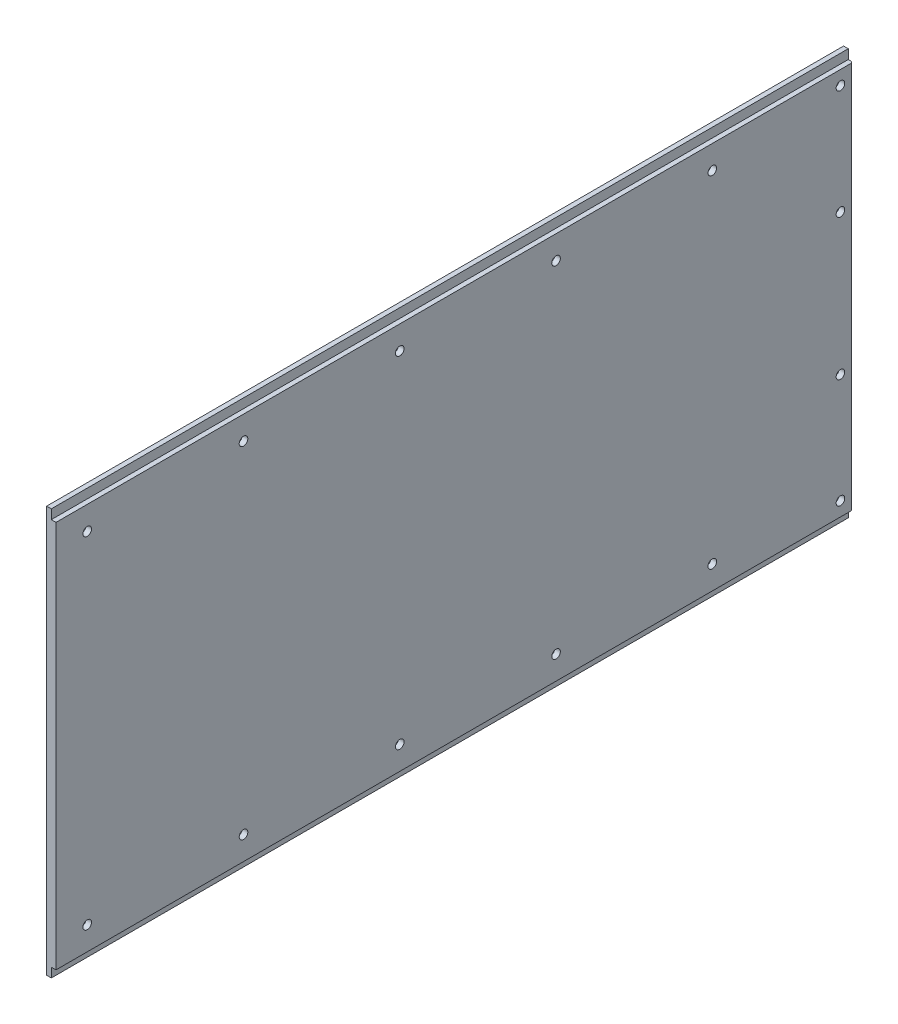
ISO-10303-21;
HEADER;
FILE_DESCRIPTION(('STEP AP214'),'2;1');
FILE_NAME('part.step','',(''),(''),'','','');
FILE_SCHEMA(('AUTOMOTIVE_DESIGN { 1 0 10303 214 1 1 1 1 }'));
ENDSEC;
DATA;
#1=APPLICATION_CONTEXT('core data for automotive mechanical design processes');
#2=APPLICATION_PROTOCOL_DEFINITION('international standard','automotive_design',2000,#1);
#3=PRODUCT_CONTEXT('',#1,'mechanical');
#4=PRODUCT('Part','Part','',(#3));
#5=PRODUCT_RELATED_PRODUCT_CATEGORY('part','',(#4));
#6=PRODUCT_DEFINITION_FORMATION('','',#4);
#7=PRODUCT_DEFINITION_CONTEXT('part definition',#1,'design');
#8=PRODUCT_DEFINITION('design','',#6,#7);
#9=PRODUCT_DEFINITION_SHAPE('','',#8);
#10=(LENGTH_UNIT() NAMED_UNIT(*) SI_UNIT(.MILLI.,.METRE.));
#11=(NAMED_UNIT(*) PLANE_ANGLE_UNIT() SI_UNIT($,.RADIAN.));
#12=(NAMED_UNIT(*) SI_UNIT($,.STERADIAN.) SOLID_ANGLE_UNIT());
#13=UNCERTAINTY_MEASURE_WITH_UNIT(LENGTH_MEASURE(1.E-05),#10,'distance_accuracy_value','');
#14=(GEOMETRIC_REPRESENTATION_CONTEXT(3) GLOBAL_UNCERTAINTY_ASSIGNED_CONTEXT((#13)) GLOBAL_UNIT_ASSIGNED_CONTEXT((#10,
#11,#12)) REPRESENTATION_CONTEXT('',''));
#15=CARTESIAN_POINT('',(0.,0.,0.));
#16=DIRECTION('',(0.,0.,1.));
#17=DIRECTION('',(1.,0.,0.));
#18=AXIS2_PLACEMENT_3D('',#15,#16,#17);
#19=CARTESIAN_POINT('',(6.,-130.,255.));
#20=DIRECTION('',(0.,0.,-1.));
#21=DIRECTION('',(-1.,0.,0.));
#22=AXIS2_PLACEMENT_3D('',#19,#20,#21);
#23=PLANE('',#22);
#24=DIRECTION('',(0.,-1.,0.));
#25=VECTOR('',#24,1.);
#26=CARTESIAN_POINT('',(6.,-130.,255.));
#27=LINE('',#26,#25);
#28=CARTESIAN_POINT('',(6.,124.,255.));
#29=VERTEX_POINT('',#28);
#30=CARTESIAN_POINT('',(6.,-124.,255.));
#31=VERTEX_POINT('',#30);
#32=EDGE_CURVE('E132',#29,#31,#27,.T.);
#33=ORIENTED_EDGE('',*,*,#32,.F.);
#34=DIRECTION('',(1.,0.,0.));
#35=VECTOR('',#34,1.);
#36=CARTESIAN_POINT('',(6.,124.,255.));
#37=LINE('',#36,#35);
#38=CARTESIAN_POINT('',(3.,124.,255.));
#39=VERTEX_POINT('',#38);
#40=EDGE_CURVE('E114',#39,#29,#37,.T.);
#41=ORIENTED_EDGE('',*,*,#40,.F.);
#42=DIRECTION('',(0.,-1.,0.));
#43=VECTOR('',#42,1.);
#44=CARTESIAN_POINT('',(3.,130.,255.));
#45=LINE('',#44,#43);
#46=CARTESIAN_POINT('',(3.,130.,255.));
#47=VERTEX_POINT('',#46);
#48=EDGE_CURVE('E606',#47,#39,#45,.T.);
#49=ORIENTED_EDGE('',*,*,#48,.F.);
#50=DIRECTION('',(-1.,0.,0.));
#51=VECTOR('',#50,1.);
#52=CARTESIAN_POINT('',(6.,130.,255.));
#53=LINE('',#52,#51);
#54=CARTESIAN_POINT('',(0.,130.,255.));
#55=VERTEX_POINT('',#54);
#56=EDGE_CURVE('E122',#47,#55,#53,.T.);
#57=ORIENTED_EDGE('',*,*,#56,.T.);
#58=DIRECTION('',(0.,-1.,0.));
#59=VECTOR('',#58,1.);
#60=CARTESIAN_POINT('',(0.,-130.,255.));
#61=LINE('',#60,#59);
#62=CARTESIAN_POINT('',(0.,-130.,255.));
#63=VERTEX_POINT('',#62);
#64=EDGE_CURVE('E590',#55,#63,#61,.T.);
#65=ORIENTED_EDGE('',*,*,#64,.T.);
#66=DIRECTION('',(-1.,0.,0.));
#67=VECTOR('',#66,1.);
#68=CARTESIAN_POINT('',(6.,-130.,255.));
#69=LINE('',#68,#67);
#70=CARTESIAN_POINT('',(3.,-130.,255.));
#71=VERTEX_POINT('',#70);
#72=EDGE_CURVE('E130',#71,#63,#69,.T.);
#73=ORIENTED_EDGE('',*,*,#72,.F.);
#74=DIRECTION('',(0.,-1.,0.));
#75=VECTOR('',#74,1.);
#76=CARTESIAN_POINT('',(3.,-130.,255.));
#77=LINE('',#76,#75);
#78=CARTESIAN_POINT('',(3.,-124.,255.));
#79=VERTEX_POINT('',#78);
#80=EDGE_CURVE('E568',#79,#71,#77,.T.);
#81=ORIENTED_EDGE('',*,*,#80,.F.);
#82=DIRECTION('',(-1.,0.,0.));
#83=VECTOR('',#82,1.);
#84=CARTESIAN_POINT('',(6.,-124.,255.));
#85=LINE('',#84,#83);
#86=EDGE_CURVE('E578',#31,#79,#85,.T.);
#87=ORIENTED_EDGE('',*,*,#86,.F.);
#88=EDGE_LOOP('',(#33,#41,#49,#57,#65,#73,#81,#87));
#89=FACE_BOUND('',#88,.T.);
#90=ADVANCED_FACE('F34',(#89),#23,.F.);
#91=CARTESIAN_POINT('',(6.,-130.,-255.));
#92=DIRECTION('',(0.,1.,0.));
#93=DIRECTION('',(0.,0.,1.));
#94=AXIS2_PLACEMENT_3D('',#91,#92,#93);
#95=PLANE('',#94);
#96=DIRECTION('',(-1.,0.,0.));
#97=VECTOR('',#96,1.);
#98=CARTESIAN_POINT('',(6.,-130.,-255.));
#99=LINE('',#98,#97);
#100=CARTESIAN_POINT('',(3.,-130.,-255.));
#101=VERTEX_POINT('',#100);
#102=CARTESIAN_POINT('',(0.,-130.,-255.));
#103=VERTEX_POINT('',#102);
#104=EDGE_CURVE('E128',#101,#103,#99,.T.);
#105=ORIENTED_EDGE('',*,*,#104,.F.);
#106=DIRECTION('',(0.,0.,1.));
#107=VECTOR('',#106,1.);
#108=CARTESIAN_POINT('',(3.,-130.,-255.));
#109=LINE('',#108,#107);
#110=EDGE_CURVE('E587',#101,#71,#109,.T.);
#111=ORIENTED_EDGE('',*,*,#110,.T.);
#112=ORIENTED_EDGE('',*,*,#72,.T.);
#113=DIRECTION('',(0.,0.,-1.));
#114=VECTOR('',#113,1.);
#115=CARTESIAN_POINT('',(0.,-130.,-255.));
#116=LINE('',#115,#114);
#117=EDGE_CURVE('E597',#63,#103,#116,.T.);
#118=ORIENTED_EDGE('',*,*,#117,.T.);
#119=EDGE_LOOP('',(#105,#111,#112,#118));
#120=FACE_BOUND('',#119,.T.);
#121=ADVANCED_FACE('F198',(#120),#95,.F.);
#122=CARTESIAN_POINT('',(6.,130.,-255.));
#123=DIRECTION('',(0.,0.,1.));
#124=DIRECTION('',(1.,0.,0.));
#125=AXIS2_PLACEMENT_3D('',#122,#123,#124);
#126=PLANE('',#125);
#127=DIRECTION('',(1.,0.,0.));
#128=VECTOR('',#127,1.);
#129=CARTESIAN_POINT('',(6.,124.,-255.));
#130=LINE('',#129,#128);
#131=CARTESIAN_POINT('',(3.,124.,-255.));
#132=VERTEX_POINT('',#131);
#133=CARTESIAN_POINT('',(5.00000000000006,124.,-255.));
#134=VERTEX_POINT('',#133);
#135=EDGE_CURVE('E113',#132,#134,#130,.T.);
#136=ORIENTED_EDGE('',*,*,#135,.T.);
#137=DIRECTION('',(0.,-1.,0.));
#138=VECTOR('',#137,1.);
#139=CARTESIAN_POINT('',(5.00000000000006,130.,-255.));
#140=LINE('',#139,#138);
#141=CARTESIAN_POINT('',(5.00000000000006,-124.,-255.));
#142=VERTEX_POINT('',#141);
#143=EDGE_CURVE('E49',#134,#142,#140,.T.);
#144=ORIENTED_EDGE('',*,*,#143,.T.);
#145=DIRECTION('',(-1.,0.,0.));
#146=VECTOR('',#145,1.);
#147=CARTESIAN_POINT('',(6.,-124.,-255.));
#148=LINE('',#147,#146);
#149=CARTESIAN_POINT('',(3.,-124.,-255.));
#150=VERTEX_POINT('',#149);
#151=EDGE_CURVE('E560',#142,#150,#148,.T.);
#152=ORIENTED_EDGE('',*,*,#151,.T.);
#153=DIRECTION('',(0.,-1.,0.));
#154=VECTOR('',#153,1.);
#155=CARTESIAN_POINT('',(3.,-130.,-255.));
#156=LINE('',#155,#154);
#157=EDGE_CURVE('E567',#150,#101,#156,.T.);
#158=ORIENTED_EDGE('',*,*,#157,.T.);
#159=ORIENTED_EDGE('',*,*,#104,.T.);
#160=DIRECTION('',(0.,1.,0.));
#161=VECTOR('',#160,1.);
#162=CARTESIAN_POINT('',(0.,130.,-255.));
#163=LINE('',#162,#161);
#164=CARTESIAN_POINT('',(0.,130.,-255.));
#165=VERTEX_POINT('',#164);
#166=EDGE_CURVE('E126',#103,#165,#163,.T.);
#167=ORIENTED_EDGE('',*,*,#166,.T.);
#168=DIRECTION('',(-1.,0.,0.));
#169=VECTOR('',#168,1.);
#170=CARTESIAN_POINT('',(6.,130.,-255.));
#171=LINE('',#170,#169);
#172=CARTESIAN_POINT('',(3.,130.,-255.));
#173=VERTEX_POINT('',#172);
#174=EDGE_CURVE('E120',#173,#165,#171,.T.);
#175=ORIENTED_EDGE('',*,*,#174,.F.);
#176=DIRECTION('',(0.,-1.,0.));
#177=VECTOR('',#176,1.);
#178=CARTESIAN_POINT('',(3.,130.,-255.));
#179=LINE('',#178,#177);
#180=EDGE_CURVE('E105',#173,#132,#179,.T.);
#181=ORIENTED_EDGE('',*,*,#180,.T.);
#182=EDGE_LOOP('',(#136,#144,#152,#158,#159,#167,#175,#181));
#183=FACE_BOUND('',#182,.T.);
#184=ADVANCED_FACE('F124',(#183),#126,.F.);
#185=CARTESIAN_POINT('',(6.,130.,255.));
#186=DIRECTION('',(0.,-1.,0.));
#187=DIRECTION('',(0.,0.,-1.));
#188=AXIS2_PLACEMENT_3D('',#185,#186,#187);
#189=PLANE('',#188);
#190=ORIENTED_EDGE('',*,*,#56,.F.);
#191=DIRECTION('',(0.,0.,1.));
#192=VECTOR('',#191,1.);
#193=CARTESIAN_POINT('',(3.,130.,-255.));
#194=LINE('',#193,#192);
#195=EDGE_CURVE('E109',#173,#47,#194,.T.);
#196=ORIENTED_EDGE('',*,*,#195,.F.);
#197=ORIENTED_EDGE('',*,*,#174,.T.);
#198=DIRECTION('',(0.,0.,1.));
#199=VECTOR('',#198,1.);
#200=CARTESIAN_POINT('',(0.,130.,255.));
#201=LINE('',#200,#199);
#202=EDGE_CURVE('E594',#165,#55,#201,.T.);
#203=ORIENTED_EDGE('',*,*,#202,.T.);
#204=EDGE_LOOP('',(#190,#196,#197,#203));
#205=FACE_BOUND('',#204,.T.);
#206=ADVANCED_FACE('F118',(#205),#189,.F.);
#207=CARTESIAN_POINT('',(6.,0.,0.));
#208=DIRECTION('',(-1.,0.,0.));
#209=DIRECTION('',(0.,0.,1.));
#210=AXIS2_PLACEMENT_3D('',#207,#208,#209);
#211=PLANE('',#210);
#212=CARTESIAN_POINT('',(6.00000000000001,109.,-165.));
#213=DIRECTION('',(-1.,0.,0.));
#214=DIRECTION('',(0.,0.,1.));
#215=AXIS2_PLACEMENT_3D('',#212,#213,#214);
#216=CIRCLE('',#215,2.74999999999999);
#217=CARTESIAN_POINT('',(6.00000000000001,109.,-162.25));
#218=VERTEX_POINT('',#217);
#219=EDGE_CURVE('E699',#218,#218,#216,.T.);
#220=ORIENTED_EDGE('',*,*,#219,.T.);
#221=EDGE_LOOP('',(#220));
#222=FACE_BOUND('',#221,.T.);
#223=CARTESIAN_POINT('',(6.00000000000001,109.,-65.));
#224=DIRECTION('',(-1.,0.,0.));
#225=DIRECTION('',(0.,0.,1.));
#226=AXIS2_PLACEMENT_3D('',#223,#224,#225);
#227=CIRCLE('',#226,2.74999999999999);
#228=CARTESIAN_POINT('',(6.00000000000001,109.,-62.25));
#229=VERTEX_POINT('',#228);
#230=EDGE_CURVE('E690',#229,#229,#227,.T.);
#231=ORIENTED_EDGE('',*,*,#230,.T.);
#232=EDGE_LOOP('',(#231));
#233=FACE_BOUND('',#232,.T.);
#234=CARTESIAN_POINT('',(6.00000000000001,109.,35.));
#235=DIRECTION('',(-1.,0.,0.));
#236=DIRECTION('',(0.,0.,1.));
#237=AXIS2_PLACEMENT_3D('',#234,#235,#236);
#238=CIRCLE('',#237,2.74999999999999);
#239=CARTESIAN_POINT('',(6.00000000000001,109.,37.75));
#240=VERTEX_POINT('',#239);
#241=EDGE_CURVE('E681',#240,#240,#238,.T.);
#242=ORIENTED_EDGE('',*,*,#241,.T.);
#243=EDGE_LOOP('',(#242));
#244=FACE_BOUND('',#243,.T.);
#245=CARTESIAN_POINT('',(6.00000000000001,109.,135.));
#246=DIRECTION('',(-1.,0.,0.));
#247=DIRECTION('',(0.,0.,1.));
#248=AXIS2_PLACEMENT_3D('',#245,#246,#247);
#249=CIRCLE('',#248,2.74999999999999);
#250=CARTESIAN_POINT('',(6.00000000000001,109.,137.75));
#251=VERTEX_POINT('',#250);
#252=EDGE_CURVE('E672',#251,#251,#249,.T.);
#253=ORIENTED_EDGE('',*,*,#252,.T.);
#254=EDGE_LOOP('',(#253));
#255=FACE_BOUND('',#254,.T.);
#256=CARTESIAN_POINT('',(6.00000000000001,109.,235.));
#257=DIRECTION('',(-1.,0.,0.));
#258=DIRECTION('',(0.,0.,1.));
#259=AXIS2_PLACEMENT_3D('',#256,#257,#258);
#260=CIRCLE('',#259,2.74999999999999);
#261=CARTESIAN_POINT('',(6.00000000000001,109.,237.75));
#262=VERTEX_POINT('',#261);
#263=EDGE_CURVE('E663',#262,#262,#260,.T.);
#264=ORIENTED_EDGE('',*,*,#263,.T.);
#265=EDGE_LOOP('',(#264));
#266=FACE_BOUND('',#265,.T.);
#267=CARTESIAN_POINT('',(6.00000000000001,-109.,135.));
#268=DIRECTION('',(-1.,0.,0.));
#269=DIRECTION('',(0.,0.,1.));
#270=AXIS2_PLACEMENT_3D('',#267,#268,#269);
#271=CIRCLE('',#270,2.74999999999999);
#272=CARTESIAN_POINT('',(6.00000000000001,-109.,137.75));
#273=VERTEX_POINT('',#272);
#274=EDGE_CURVE('E657',#273,#273,#271,.T.);
#275=ORIENTED_EDGE('',*,*,#274,.T.);
#276=EDGE_LOOP('',(#275));
#277=FACE_BOUND('',#276,.T.);
#278=CARTESIAN_POINT('',(6.00000000000001,-109.,235.));
#279=DIRECTION('',(-1.,0.,0.));
#280=DIRECTION('',(0.,0.,1.));
#281=AXIS2_PLACEMENT_3D('',#278,#279,#280);
#282=CIRCLE('',#281,2.74999999999999);
#283=CARTESIAN_POINT('',(6.00000000000001,-109.,237.75));
#284=VERTEX_POINT('',#283);
#285=EDGE_CURVE('E645',#284,#284,#282,.T.);
#286=ORIENTED_EDGE('',*,*,#285,.T.);
#287=EDGE_LOOP('',(#286));
#288=FACE_BOUND('',#287,.T.);
#289=CARTESIAN_POINT('',(6.,-115.,-247.));
#290=DIRECTION('',(-1.,0.,0.));
#291=DIRECTION('',(0.,0.,1.));
#292=AXIS2_PLACEMENT_3D('',#289,#290,#291);
#293=CIRCLE('',#292,2.75);
#294=CARTESIAN_POINT('',(6.,-115.,-244.25));
#295=VERTEX_POINT('',#294);
#296=EDGE_CURVE('E636',#295,#295,#293,.T.);
#297=ORIENTED_EDGE('',*,*,#296,.T.);
#298=EDGE_LOOP('',(#297));
#299=FACE_BOUND('',#298,.T.);
#300=CARTESIAN_POINT('',(6.,-45.,-247.));
#301=DIRECTION('',(-1.,0.,0.));
#302=DIRECTION('',(0.,0.,1.));
#303=AXIS2_PLACEMENT_3D('',#300,#301,#302);
#304=CIRCLE('',#303,2.75);
#305=CARTESIAN_POINT('',(6.,-45.,-244.25));
#306=VERTEX_POINT('',#305);
#307=EDGE_CURVE('E627',#306,#306,#304,.T.);
#308=ORIENTED_EDGE('',*,*,#307,.T.);
#309=EDGE_LOOP('',(#308));
#310=FACE_BOUND('',#309,.T.);
#311=CARTESIAN_POINT('',(6.,115.,-247.));
#312=DIRECTION('',(-1.,0.,0.));
#313=DIRECTION('',(0.,0.,1.));
#314=AXIS2_PLACEMENT_3D('',#311,#312,#313);
#315=CIRCLE('',#314,2.75);
#316=CARTESIAN_POINT('',(6.,115.,-244.25));
#317=VERTEX_POINT('',#316);
#318=EDGE_CURVE('E618',#317,#317,#315,.T.);
#319=ORIENTED_EDGE('',*,*,#318,.T.);
#320=EDGE_LOOP('',(#319));
#321=FACE_BOUND('',#320,.T.);
#322=CARTESIAN_POINT('',(6.,45.,-247.));
#323=DIRECTION('',(-1.,0.,0.));
#324=DIRECTION('',(0.,0.,1.));
#325=AXIS2_PLACEMENT_3D('',#322,#323,#324);
#326=CIRCLE('',#325,2.75);
#327=CARTESIAN_POINT('',(6.,45.,-244.25));
#328=VERTEX_POINT('',#327);
#329=EDGE_CURVE('E607',#328,#328,#326,.T.);
#330=ORIENTED_EDGE('',*,*,#329,.T.);
#331=EDGE_LOOP('',(#330));
#332=FACE_BOUND('',#331,.T.);
#333=DIRECTION('',(0.,0.,1.));
#334=VECTOR('',#333,1.);
#335=CARTESIAN_POINT('',(6.,-124.,-255.));
#336=LINE('',#335,#334);
#337=CARTESIAN_POINT('',(6.,-124.,-254.));
#338=VERTEX_POINT('',#337);
#339=EDGE_CURVE('E576',#338,#31,#336,.T.);
#340=ORIENTED_EDGE('',*,*,#339,.F.);
#341=DIRECTION('',(0.,1.,0.));
#342=VECTOR('',#341,1.);
#343=CARTESIAN_POINT('',(6.,0.,-254.));
#344=LINE('',#343,#342);
#345=CARTESIAN_POINT('',(6.,124.,-254.));
#346=VERTEX_POINT('',#345);
#347=EDGE_CURVE('E137',#338,#346,#344,.T.);
#348=ORIENTED_EDGE('',*,*,#347,.T.);
#349=DIRECTION('',(0.,0.,1.));
#350=VECTOR('',#349,1.);
#351=CARTESIAN_POINT('',(6.,124.,-255.));
#352=LINE('',#351,#350);
#353=EDGE_CURVE('E574',#346,#29,#352,.T.);
#354=ORIENTED_EDGE('',*,*,#353,.T.);
#355=ORIENTED_EDGE('',*,*,#32,.T.);
#356=EDGE_LOOP('',(#340,#348,#354,#355));
#357=FACE_BOUND('',#356,.T.);
#358=CARTESIAN_POINT('',(6.00000000000001,-109.,35.));
#359=DIRECTION('',(-1.,0.,0.));
#360=DIRECTION('',(0.,0.,1.));
#361=AXIS2_PLACEMENT_3D('',#358,#359,#360);
#362=CIRCLE('',#361,2.74999999999999);
#363=CARTESIAN_POINT('',(6.00000000000001,-109.,37.75));
#364=VERTEX_POINT('',#363);
#365=EDGE_CURVE('E147',#364,#364,#362,.T.);
#366=ORIENTED_EDGE('',*,*,#365,.T.);
#367=EDGE_LOOP('',(#366));
#368=FACE_BOUND('',#367,.T.);
#369=CARTESIAN_POINT('',(6.00000000000001,-109.,-65.));
#370=DIRECTION('',(-1.,0.,0.));
#371=DIRECTION('',(0.,0.,1.));
#372=AXIS2_PLACEMENT_3D('',#369,#370,#371);
#373=CIRCLE('',#372,2.74999999999999);
#374=CARTESIAN_POINT('',(6.00000000000001,-109.,-62.25));
#375=VERTEX_POINT('',#374);
#376=EDGE_CURVE('E156',#375,#375,#373,.T.);
#377=ORIENTED_EDGE('',*,*,#376,.T.);
#378=EDGE_LOOP('',(#377));
#379=FACE_BOUND('',#378,.T.);
#380=CARTESIAN_POINT('',(6.00000000000001,-109.,-165.));
#381=DIRECTION('',(-1.,0.,0.));
#382=DIRECTION('',(0.,0.,1.));
#383=AXIS2_PLACEMENT_3D('',#380,#381,#382);
#384=CIRCLE('',#383,2.74999999999999);
#385=CARTESIAN_POINT('',(6.00000000000001,-109.,-162.25));
#386=VERTEX_POINT('',#385);
#387=EDGE_CURVE('E42',#386,#386,#384,.T.);
#388=ORIENTED_EDGE('',*,*,#387,.T.);
#389=EDGE_LOOP('',(#388));
#390=FACE_BOUND('',#389,.T.);
#391=ADVANCED_FACE('F167',(#222,#233,#244,#255,#266,#277,#288,#299,#310,#321,#332,#357,#368,
#379,#390),#211,.F.);
#392=CARTESIAN_POINT('',(0.,0.,0.));
#393=DIRECTION('',(-1.,0.,0.));
#394=DIRECTION('',(0.,0.,1.));
#395=AXIS2_PLACEMENT_3D('',#392,#393,#394);
#396=PLANE('',#395);
#397=CARTESIAN_POINT('',(0.,109.,-165.));
#398=DIRECTION('',(-1.,0.,0.));
#399=DIRECTION('',(0.,0.,1.));
#400=AXIS2_PLACEMENT_3D('',#397,#398,#399);
#401=CIRCLE('',#400,5.2);
#402=CARTESIAN_POINT('',(0.,109.,-159.8));
#403=VERTEX_POINT('',#402);
#404=EDGE_CURVE('E705',#403,#403,#401,.T.);
#405=ORIENTED_EDGE('',*,*,#404,.F.);
#406=EDGE_LOOP('',(#405));
#407=FACE_BOUND('',#406,.T.);
#408=CARTESIAN_POINT('',(0.,109.,-65.));
#409=DIRECTION('',(-1.,0.,0.));
#410=DIRECTION('',(0.,0.,1.));
#411=AXIS2_PLACEMENT_3D('',#408,#409,#410);
#412=CIRCLE('',#411,5.2);
#413=CARTESIAN_POINT('',(0.,109.,-59.8));
#414=VERTEX_POINT('',#413);
#415=EDGE_CURVE('E696',#414,#414,#412,.T.);
#416=ORIENTED_EDGE('',*,*,#415,.F.);
#417=EDGE_LOOP('',(#416));
#418=FACE_BOUND('',#417,.T.);
#419=CARTESIAN_POINT('',(0.,109.,35.));
#420=DIRECTION('',(-1.,0.,0.));
#421=DIRECTION('',(0.,0.,1.));
#422=AXIS2_PLACEMENT_3D('',#419,#420,#421);
#423=CIRCLE('',#422,5.2);
#424=CARTESIAN_POINT('',(0.,109.,40.2));
#425=VERTEX_POINT('',#424);
#426=EDGE_CURVE('E687',#425,#425,#423,.T.);
#427=ORIENTED_EDGE('',*,*,#426,.F.);
#428=EDGE_LOOP('',(#427));
#429=FACE_BOUND('',#428,.T.);
#430=CARTESIAN_POINT('',(0.,109.,135.));
#431=DIRECTION('',(-1.,0.,0.));
#432=DIRECTION('',(0.,0.,1.));
#433=AXIS2_PLACEMENT_3D('',#430,#431,#432);
#434=CIRCLE('',#433,5.2);
#435=CARTESIAN_POINT('',(0.,109.,140.2));
#436=VERTEX_POINT('',#435);
#437=EDGE_CURVE('E678',#436,#436,#434,.T.);
#438=ORIENTED_EDGE('',*,*,#437,.F.);
#439=EDGE_LOOP('',(#438));
#440=FACE_BOUND('',#439,.T.);
#441=CARTESIAN_POINT('',(0.,109.,235.));
#442=DIRECTION('',(-1.,0.,0.));
#443=DIRECTION('',(0.,0.,1.));
#444=AXIS2_PLACEMENT_3D('',#441,#442,#443);
#445=CIRCLE('',#444,5.2);
#446=CARTESIAN_POINT('',(0.,109.,240.2));
#447=VERTEX_POINT('',#446);
#448=EDGE_CURVE('E669',#447,#447,#445,.T.);
#449=ORIENTED_EDGE('',*,*,#448,.F.);
#450=EDGE_LOOP('',(#449));
#451=FACE_BOUND('',#450,.T.);
#452=CARTESIAN_POINT('',(0.,-109.,135.));
#453=DIRECTION('',(-1.,0.,0.));
#454=DIRECTION('',(0.,0.,1.));
#455=AXIS2_PLACEMENT_3D('',#452,#453,#454);
#456=CIRCLE('',#455,5.2);
#457=CARTESIAN_POINT('',(0.,-109.,140.2));
#458=VERTEX_POINT('',#457);
#459=EDGE_CURVE('E660',#458,#458,#456,.T.);
#460=ORIENTED_EDGE('',*,*,#459,.F.);
#461=EDGE_LOOP('',(#460));
#462=FACE_BOUND('',#461,.T.);
#463=CARTESIAN_POINT('',(0.,-109.,235.));
#464=DIRECTION('',(-1.,0.,0.));
#465=DIRECTION('',(0.,0.,1.));
#466=AXIS2_PLACEMENT_3D('',#463,#464,#465);
#467=CIRCLE('',#466,5.2);
#468=CARTESIAN_POINT('',(0.,-109.,240.2));
#469=VERTEX_POINT('',#468);
#470=EDGE_CURVE('E651',#469,#469,#467,.T.);
#471=ORIENTED_EDGE('',*,*,#470,.F.);
#472=EDGE_LOOP('',(#471));
#473=FACE_BOUND('',#472,.T.);
#474=CARTESIAN_POINT('',(0.,-115.,-247.));
#475=DIRECTION('',(-1.,0.,0.));
#476=DIRECTION('',(0.,0.,1.));
#477=AXIS2_PLACEMENT_3D('',#474,#475,#476);
#478=CIRCLE('',#477,5.2);
#479=CARTESIAN_POINT('',(0.,-115.,-241.8));
#480=VERTEX_POINT('',#479);
#481=EDGE_CURVE('E642',#480,#480,#478,.T.);
#482=ORIENTED_EDGE('',*,*,#481,.F.);
#483=EDGE_LOOP('',(#482));
#484=FACE_BOUND('',#483,.T.);
#485=CARTESIAN_POINT('',(0.,-45.,-247.));
#486=DIRECTION('',(-1.,0.,0.));
#487=DIRECTION('',(0.,0.,1.));
#488=AXIS2_PLACEMENT_3D('',#485,#486,#487);
#489=CIRCLE('',#488,5.2);
#490=CARTESIAN_POINT('',(0.,-45.,-241.8));
#491=VERTEX_POINT('',#490);
#492=EDGE_CURVE('E633',#491,#491,#489,.T.);
#493=ORIENTED_EDGE('',*,*,#492,.F.);
#494=EDGE_LOOP('',(#493));
#495=FACE_BOUND('',#494,.T.);
#496=CARTESIAN_POINT('',(0.,115.,-247.));
#497=DIRECTION('',(-1.,0.,0.));
#498=DIRECTION('',(0.,0.,1.));
#499=AXIS2_PLACEMENT_3D('',#496,#497,#498);
#500=CIRCLE('',#499,5.2);
#501=CARTESIAN_POINT('',(0.,115.,-241.8));
#502=VERTEX_POINT('',#501);
#503=EDGE_CURVE('E624',#502,#502,#500,.T.);
#504=ORIENTED_EDGE('',*,*,#503,.F.);
#505=EDGE_LOOP('',(#504));
#506=FACE_BOUND('',#505,.T.);
#507=CARTESIAN_POINT('',(0.,45.,-247.));
#508=DIRECTION('',(-1.,0.,0.));
#509=DIRECTION('',(0.,0.,1.));
#510=AXIS2_PLACEMENT_3D('',#507,#508,#509);
#511=CIRCLE('',#510,5.2);
#512=CARTESIAN_POINT('',(0.,45.,-241.8));
#513=VERTEX_POINT('',#512);
#514=EDGE_CURVE('E615',#513,#513,#511,.T.);
#515=ORIENTED_EDGE('',*,*,#514,.F.);
#516=EDGE_LOOP('',(#515));
#517=FACE_BOUND('',#516,.T.);
#518=ORIENTED_EDGE('',*,*,#64,.F.);
#519=ORIENTED_EDGE('',*,*,#202,.F.);
#520=ORIENTED_EDGE('',*,*,#166,.F.);
#521=ORIENTED_EDGE('',*,*,#117,.F.);
#522=EDGE_LOOP('',(#518,#519,#520,#521));
#523=FACE_BOUND('',#522,.T.);
#524=CARTESIAN_POINT('',(0.,-109.,35.));
#525=DIRECTION('',(-1.,0.,0.));
#526=DIRECTION('',(0.,0.,1.));
#527=AXIS2_PLACEMENT_3D('',#524,#525,#526);
#528=CIRCLE('',#527,5.2);
#529=CARTESIAN_POINT('',(0.,-109.,40.2));
#530=VERTEX_POINT('',#529);
#531=EDGE_CURVE('E144',#530,#530,#528,.T.);
#532=ORIENTED_EDGE('',*,*,#531,.F.);
#533=EDGE_LOOP('',(#532));
#534=FACE_BOUND('',#533,.T.);
#535=CARTESIAN_POINT('',(0.,-109.,-65.));
#536=DIRECTION('',(-1.,0.,0.));
#537=DIRECTION('',(0.,0.,1.));
#538=AXIS2_PLACEMENT_3D('',#535,#536,#537);
#539=CIRCLE('',#538,5.2);
#540=CARTESIAN_POINT('',(0.,-109.,-59.8));
#541=VERTEX_POINT('',#540);
#542=EDGE_CURVE('E153',#541,#541,#539,.T.);
#543=ORIENTED_EDGE('',*,*,#542,.F.);
#544=EDGE_LOOP('',(#543));
#545=FACE_BOUND('',#544,.T.);
#546=CARTESIAN_POINT('',(0.,-109.,-165.));
#547=DIRECTION('',(-1.,0.,0.));
#548=DIRECTION('',(0.,0.,1.));
#549=AXIS2_PLACEMENT_3D('',#546,#547,#548);
#550=CIRCLE('',#549,5.2);
#551=CARTESIAN_POINT('',(0.,-109.,-159.8));
#552=VERTEX_POINT('',#551);
#553=EDGE_CURVE('E162',#552,#552,#550,.T.);
#554=ORIENTED_EDGE('',*,*,#553,.F.);
#555=EDGE_LOOP('',(#554));
#556=FACE_BOUND('',#555,.T.);
#557=ADVANCED_FACE('F180',(#407,#418,#429,#440,#451,#462,#473,#484,#495,#506,#517,#523,#534,
#545,#556),#396,.T.);
#558=CARTESIAN_POINT('',(3.,-130.,-255.));
#559=DIRECTION('',(-1.,0.,0.));
#560=DIRECTION('',(0.,0.,1.));
#561=AXIS2_PLACEMENT_3D('',#558,#559,#560);
#562=PLANE('',#561);
#563=ORIENTED_EDGE('',*,*,#80,.T.);
#564=ORIENTED_EDGE('',*,*,#110,.F.);
#565=ORIENTED_EDGE('',*,*,#157,.F.);
#566=DIRECTION('',(0.,0.,1.));
#567=VECTOR('',#566,1.);
#568=CARTESIAN_POINT('',(3.,-124.,-255.));
#569=LINE('',#568,#567);
#570=EDGE_CURVE('E564',#150,#79,#569,.T.);
#571=ORIENTED_EDGE('',*,*,#570,.T.);
#572=EDGE_LOOP('',(#563,#564,#565,#571));
#573=FACE_BOUND('',#572,.T.);
#574=ADVANCED_FACE('F182',(#573),#562,.F.);
#575=CARTESIAN_POINT('',(6.,-124.,-255.));
#576=DIRECTION('',(0.,1.,0.));
#577=DIRECTION('',(0.,0.,1.));
#578=AXIS2_PLACEMENT_3D('',#575,#576,#577);
#579=PLANE('',#578);
#580=ORIENTED_EDGE('',*,*,#151,.F.);
#581=DIRECTION('',(-0.707106781186528,0.,-0.707106781186567));
#582=VECTOR('',#581,1.);
#583=CARTESIAN_POINT('',(6.,-124.,-254.));
#584=LINE('',#583,#582);
#585=EDGE_CURVE('E142',#142,#338,#584,.F.);
#586=ORIENTED_EDGE('',*,*,#585,.T.);
#587=ORIENTED_EDGE('',*,*,#339,.T.);
#588=ORIENTED_EDGE('',*,*,#86,.T.);
#589=ORIENTED_EDGE('',*,*,#570,.F.);
#590=EDGE_LOOP('',(#580,#586,#587,#588,#589));
#591=FACE_BOUND('',#590,.T.);
#592=ADVANCED_FACE('F189',(#591),#579,.F.);
#593=CARTESIAN_POINT('',(6.,124.,-255.));
#594=DIRECTION('',(0.,-1.,0.));
#595=DIRECTION('',(0.,0.,-1.));
#596=AXIS2_PLACEMENT_3D('',#593,#594,#595);
#597=PLANE('',#596);
#598=ORIENTED_EDGE('',*,*,#353,.F.);
#599=DIRECTION('',(0.707106781186528,0.,0.707106781186567));
#600=VECTOR('',#599,1.);
#601=CARTESIAN_POINT('',(6.,124.,-254.));
#602=LINE('',#601,#600);
#603=EDGE_CURVE('E57',#346,#134,#602,.F.);
#604=ORIENTED_EDGE('',*,*,#603,.T.);
#605=ORIENTED_EDGE('',*,*,#135,.F.);
#606=DIRECTION('',(0.,0.,1.));
#607=VECTOR('',#606,1.);
#608=CARTESIAN_POINT('',(3.,124.,-255.));
#609=LINE('',#608,#607);
#610=EDGE_CURVE('E111',#132,#39,#609,.T.);
#611=ORIENTED_EDGE('',*,*,#610,.T.);
#612=ORIENTED_EDGE('',*,*,#40,.T.);
#613=EDGE_LOOP('',(#598,#604,#605,#611,#612));
#614=FACE_BOUND('',#613,.T.);
#615=ADVANCED_FACE('F488',(#614),#597,.F.);
#616=CARTESIAN_POINT('',(3.,130.,-255.));
#617=DIRECTION('',(-1.,0.,0.));
#618=DIRECTION('',(0.,0.,1.));
#619=AXIS2_PLACEMENT_3D('',#616,#617,#618);
#620=PLANE('',#619);
#621=ORIENTED_EDGE('',*,*,#48,.T.);
#622=ORIENTED_EDGE('',*,*,#610,.F.);
#623=ORIENTED_EDGE('',*,*,#180,.F.);
#624=ORIENTED_EDGE('',*,*,#195,.T.);
#625=EDGE_LOOP('',(#621,#622,#623,#624));
#626=FACE_BOUND('',#625,.T.);
#627=ADVANCED_FACE('F108',(#626),#620,.F.);
#628=CARTESIAN_POINT('',(0.,45.,-247.));
#629=DIRECTION('',(-1.,0.,0.));
#630=DIRECTION('',(0.,0.,1.));
#631=AXIS2_PLACEMENT_3D('',#628,#629,#630);
#632=CYLINDRICAL_SURFACE('',#631,2.75);
#633=ORIENTED_EDGE('',*,*,#329,.F.);
#634=EDGE_LOOP('',(#633));
#635=FACE_BOUND('',#634,.T.);
#636=CARTESIAN_POINT('',(2.45,45.,-247.));
#637=DIRECTION('',(-1.,0.,0.));
#638=DIRECTION('',(0.,0.,1.));
#639=AXIS2_PLACEMENT_3D('',#636,#637,#638);
#640=CIRCLE('',#639,2.75);
#641=CARTESIAN_POINT('',(2.45,45.,-244.25));
#642=VERTEX_POINT('',#641);
#643=EDGE_CURVE('E609',#642,#642,#640,.T.);
#644=ORIENTED_EDGE('',*,*,#643,.T.);
#645=EDGE_LOOP('',(#644));
#646=FACE_BOUND('',#645,.T.);
#647=ADVANCED_FACE('F471',(#635,#646),#632,.F.);
#648=CARTESIAN_POINT('',(0.,45.,-247.));
#649=DIRECTION('',(-1.,0.,0.));
#650=DIRECTION('',(0.,0.,1.));
#651=AXIS2_PLACEMENT_3D('',#648,#649,#650);
#652=CONICAL_SURFACE('',#651,5.2,0.785398163397446);
#653=ORIENTED_EDGE('',*,*,#643,.F.);
#654=EDGE_LOOP('',(#653));
#655=FACE_BOUND('',#654,.T.);
#656=ORIENTED_EDGE('',*,*,#514,.T.);
#657=EDGE_LOOP('',(#656));
#658=FACE_BOUND('',#657,.T.);
#659=ADVANCED_FACE('F462',(#655,#658),#652,.F.);
#660=CARTESIAN_POINT('',(0.,115.,-247.));
#661=DIRECTION('',(-1.,0.,0.));
#662=DIRECTION('',(0.,0.,1.));
#663=AXIS2_PLACEMENT_3D('',#660,#661,#662);
#664=CYLINDRICAL_SURFACE('',#663,2.75);
#665=ORIENTED_EDGE('',*,*,#318,.F.);
#666=EDGE_LOOP('',(#665));
#667=FACE_BOUND('',#666,.T.);
#668=CARTESIAN_POINT('',(2.45,115.,-247.));
#669=DIRECTION('',(-1.,0.,0.));
#670=DIRECTION('',(0.,0.,1.));
#671=AXIS2_PLACEMENT_3D('',#668,#669,#670);
#672=CIRCLE('',#671,2.75);
#673=CARTESIAN_POINT('',(2.45,115.,-244.25));
#674=VERTEX_POINT('',#673);
#675=EDGE_CURVE('E621',#674,#674,#672,.T.);
#676=ORIENTED_EDGE('',*,*,#675,.T.);
#677=EDGE_LOOP('',(#676));
#678=FACE_BOUND('',#677,.T.);
#679=ADVANCED_FACE('F453',(#667,#678),#664,.F.);
#680=CARTESIAN_POINT('',(0.,115.,-247.));
#681=DIRECTION('',(-1.,0.,0.));
#682=DIRECTION('',(0.,0.,1.));
#683=AXIS2_PLACEMENT_3D('',#680,#681,#682);
#684=CONICAL_SURFACE('',#683,5.2,0.785398163397446);
#685=ORIENTED_EDGE('',*,*,#675,.F.);
#686=EDGE_LOOP('',(#685));
#687=FACE_BOUND('',#686,.T.);
#688=ORIENTED_EDGE('',*,*,#503,.T.);
#689=EDGE_LOOP('',(#688));
#690=FACE_BOUND('',#689,.T.);
#691=ADVANCED_FACE('F444',(#687,#690),#684,.F.);
#692=CARTESIAN_POINT('',(0.,-45.,-247.));
#693=DIRECTION('',(-1.,0.,0.));
#694=DIRECTION('',(0.,0.,1.));
#695=AXIS2_PLACEMENT_3D('',#692,#693,#694);
#696=CYLINDRICAL_SURFACE('',#695,2.75);
#697=ORIENTED_EDGE('',*,*,#307,.F.);
#698=EDGE_LOOP('',(#697));
#699=FACE_BOUND('',#698,.T.);
#700=CARTESIAN_POINT('',(2.45,-45.,-247.));
#701=DIRECTION('',(-1.,0.,0.));
#702=DIRECTION('',(0.,0.,1.));
#703=AXIS2_PLACEMENT_3D('',#700,#701,#702);
#704=CIRCLE('',#703,2.75);
#705=CARTESIAN_POINT('',(2.45,-45.,-244.25));
#706=VERTEX_POINT('',#705);
#707=EDGE_CURVE('E630',#706,#706,#704,.T.);
#708=ORIENTED_EDGE('',*,*,#707,.T.);
#709=EDGE_LOOP('',(#708));
#710=FACE_BOUND('',#709,.T.);
#711=ADVANCED_FACE('F435',(#699,#710),#696,.F.);
#712=CARTESIAN_POINT('',(0.,-45.,-247.));
#713=DIRECTION('',(-1.,0.,0.));
#714=DIRECTION('',(0.,0.,1.));
#715=AXIS2_PLACEMENT_3D('',#712,#713,#714);
#716=CONICAL_SURFACE('',#715,5.2,0.785398163397446);
#717=ORIENTED_EDGE('',*,*,#707,.F.);
#718=EDGE_LOOP('',(#717));
#719=FACE_BOUND('',#718,.T.);
#720=ORIENTED_EDGE('',*,*,#492,.T.);
#721=EDGE_LOOP('',(#720));
#722=FACE_BOUND('',#721,.T.);
#723=ADVANCED_FACE('F426',(#719,#722),#716,.F.);
#724=CARTESIAN_POINT('',(0.,-115.,-247.));
#725=DIRECTION('',(-1.,0.,0.));
#726=DIRECTION('',(0.,0.,1.));
#727=AXIS2_PLACEMENT_3D('',#724,#725,#726);
#728=CYLINDRICAL_SURFACE('',#727,2.75);
#729=ORIENTED_EDGE('',*,*,#296,.F.);
#730=EDGE_LOOP('',(#729));
#731=FACE_BOUND('',#730,.T.);
#732=CARTESIAN_POINT('',(2.45,-115.,-247.));
#733=DIRECTION('',(-1.,0.,0.));
#734=DIRECTION('',(0.,0.,1.));
#735=AXIS2_PLACEMENT_3D('',#732,#733,#734);
#736=CIRCLE('',#735,2.75);
#737=CARTESIAN_POINT('',(2.45,-115.,-244.25));
#738=VERTEX_POINT('',#737);
#739=EDGE_CURVE('E639',#738,#738,#736,.T.);
#740=ORIENTED_EDGE('',*,*,#739,.T.);
#741=EDGE_LOOP('',(#740));
#742=FACE_BOUND('',#741,.T.);
#743=ADVANCED_FACE('F416',(#731,#742),#728,.F.);
#744=CARTESIAN_POINT('',(0.,-115.,-247.));
#745=DIRECTION('',(-1.,0.,0.));
#746=DIRECTION('',(0.,0.,1.));
#747=AXIS2_PLACEMENT_3D('',#744,#745,#746);
#748=CONICAL_SURFACE('',#747,5.2,0.785398163397446);
#749=ORIENTED_EDGE('',*,*,#739,.F.);
#750=EDGE_LOOP('',(#749));
#751=FACE_BOUND('',#750,.T.);
#752=ORIENTED_EDGE('',*,*,#481,.T.);
#753=EDGE_LOOP('',(#752));
#754=FACE_BOUND('',#753,.T.);
#755=ADVANCED_FACE('F213',(#751,#754),#748,.F.);
#756=CARTESIAN_POINT('',(6.,0.,-254.));
#757=DIRECTION('',(-0.707106781186567,0.,0.707106781186528));
#758=DIRECTION('',(0.,1.,0.));
#759=AXIS2_PLACEMENT_3D('',#756,#757,#758);
#760=PLANE('',#759);
#761=ORIENTED_EDGE('',*,*,#585,.F.);
#762=ORIENTED_EDGE('',*,*,#143,.F.);
#763=ORIENTED_EDGE('',*,*,#603,.F.);
#764=ORIENTED_EDGE('',*,*,#347,.F.);
#765=EDGE_LOOP('',(#761,#762,#763,#764));
#766=FACE_BOUND('',#765,.T.);
#767=ADVANCED_FACE('F209',(#766),#760,.F.);
#768=CARTESIAN_POINT('',(0.,-109.,235.));
#769=DIRECTION('',(-1.,0.,0.));
#770=DIRECTION('',(0.,0.,1.));
#771=AXIS2_PLACEMENT_3D('',#768,#769,#770);
#772=CYLINDRICAL_SURFACE('',#771,2.74999999999999);
#773=ORIENTED_EDGE('',*,*,#285,.F.);
#774=EDGE_LOOP('',(#773));
#775=FACE_BOUND('',#774,.T.);
#776=CARTESIAN_POINT('',(2.45000000000001,-109.,235.));
#777=DIRECTION('',(-1.,0.,0.));
#778=DIRECTION('',(0.,0.,1.));
#779=AXIS2_PLACEMENT_3D('',#776,#777,#778);
#780=CIRCLE('',#779,2.74999999999999);
#781=CARTESIAN_POINT('',(2.45000000000001,-109.,237.75));
#782=VERTEX_POINT('',#781);
#783=EDGE_CURVE('E648',#782,#782,#780,.T.);
#784=ORIENTED_EDGE('',*,*,#783,.T.);
#785=EDGE_LOOP('',(#784));
#786=FACE_BOUND('',#785,.T.);
#787=ADVANCED_FACE('F212',(#775,#786),#772,.F.);
#788=CARTESIAN_POINT('',(0.,-109.,235.));
#789=DIRECTION('',(-1.,0.,0.));
#790=DIRECTION('',(0.,0.,1.));
#791=AXIS2_PLACEMENT_3D('',#788,#789,#790);
#792=CONICAL_SURFACE('',#791,5.2,0.785398163397448);
#793=ORIENTED_EDGE('',*,*,#783,.F.);
#794=EDGE_LOOP('',(#793));
#795=FACE_BOUND('',#794,.T.);
#796=ORIENTED_EDGE('',*,*,#470,.T.);
#797=EDGE_LOOP('',(#796));
#798=FACE_BOUND('',#797,.T.);
#799=ADVANCED_FACE('F385',(#795,#798),#792,.F.);
#800=CARTESIAN_POINT('',(0.,-109.,135.));
#801=DIRECTION('',(-1.,0.,0.));
#802=DIRECTION('',(0.,0.,1.));
#803=AXIS2_PLACEMENT_3D('',#800,#801,#802);
#804=CYLINDRICAL_SURFACE('',#803,2.74999999999999);
#805=ORIENTED_EDGE('',*,*,#274,.F.);
#806=EDGE_LOOP('',(#805));
#807=FACE_BOUND('',#806,.T.);
#808=CARTESIAN_POINT('',(2.45000000000001,-109.,135.));
#809=DIRECTION('',(-1.,0.,0.));
#810=DIRECTION('',(0.,0.,1.));
#811=AXIS2_PLACEMENT_3D('',#808,#809,#810);
#812=CIRCLE('',#811,2.74999999999999);
#813=CARTESIAN_POINT('',(2.45000000000001,-109.,137.75));
#814=VERTEX_POINT('',#813);
#815=EDGE_CURVE('E654',#814,#814,#812,.T.);
#816=ORIENTED_EDGE('',*,*,#815,.T.);
#817=EDGE_LOOP('',(#816));
#818=FACE_BOUND('',#817,.T.);
#819=ADVANCED_FACE('F376',(#807,#818),#804,.F.);
#820=CARTESIAN_POINT('',(0.,-109.,135.));
#821=DIRECTION('',(-1.,0.,0.));
#822=DIRECTION('',(0.,0.,1.));
#823=AXIS2_PLACEMENT_3D('',#820,#821,#822);
#824=CONICAL_SURFACE('',#823,5.2,0.785398163397448);
#825=ORIENTED_EDGE('',*,*,#815,.F.);
#826=EDGE_LOOP('',(#825));
#827=FACE_BOUND('',#826,.T.);
#828=ORIENTED_EDGE('',*,*,#459,.T.);
#829=EDGE_LOOP('',(#828));
#830=FACE_BOUND('',#829,.T.);
#831=ADVANCED_FACE('F223',(#827,#830),#824,.F.);
#832=CARTESIAN_POINT('',(0.,-109.,35.));
#833=DIRECTION('',(-1.,0.,0.));
#834=DIRECTION('',(0.,0.,1.));
#835=AXIS2_PLACEMENT_3D('',#832,#833,#834);
#836=CONICAL_SURFACE('',#835,5.2,0.785398163397448);
#837=CARTESIAN_POINT('',(2.45000000000001,-109.,35.));
#838=DIRECTION('',(-1.,0.,0.));
#839=DIRECTION('',(0.,0.,1.));
#840=AXIS2_PLACEMENT_3D('',#837,#838,#839);
#841=CIRCLE('',#840,2.74999999999999);
#842=CARTESIAN_POINT('',(2.45000000000001,-109.,37.75));
#843=VERTEX_POINT('',#842);
#844=EDGE_CURVE('E150',#843,#843,#841,.T.);
#845=ORIENTED_EDGE('',*,*,#844,.F.);
#846=EDGE_LOOP('',(#845));
#847=FACE_BOUND('',#846,.T.);
#848=ORIENTED_EDGE('',*,*,#531,.T.);
#849=EDGE_LOOP('',(#848));
#850=FACE_BOUND('',#849,.T.);
#851=ADVANCED_FACE('F219',(#847,#850),#836,.F.);
#852=CARTESIAN_POINT('',(0.,-109.,35.));
#853=DIRECTION('',(-1.,0.,0.));
#854=DIRECTION('',(0.,0.,1.));
#855=AXIS2_PLACEMENT_3D('',#852,#853,#854);
#856=CYLINDRICAL_SURFACE('',#855,2.74999999999999);
#857=ORIENTED_EDGE('',*,*,#365,.F.);
#858=EDGE_LOOP('',(#857));
#859=FACE_BOUND('',#858,.T.);
#860=ORIENTED_EDGE('',*,*,#844,.T.);
#861=EDGE_LOOP('',(#860));
#862=FACE_BOUND('',#861,.T.);
#863=ADVANCED_FACE('F215',(#859,#862),#856,.F.);
#864=CARTESIAN_POINT('',(0.,-109.,-65.));
#865=DIRECTION('',(-1.,0.,0.));
#866=DIRECTION('',(0.,0.,1.));
#867=AXIS2_PLACEMENT_3D('',#864,#865,#866);
#868=CONICAL_SURFACE('',#867,5.2,0.785398163397448);
#869=CARTESIAN_POINT('',(2.45000000000001,-109.,-65.));
#870=DIRECTION('',(-1.,0.,0.));
#871=DIRECTION('',(0.,0.,1.));
#872=AXIS2_PLACEMENT_3D('',#869,#870,#871);
#873=CIRCLE('',#872,2.74999999999999);
#874=CARTESIAN_POINT('',(2.45000000000001,-109.,-62.25));
#875=VERTEX_POINT('',#874);
#876=EDGE_CURVE('E159',#875,#875,#873,.T.);
#877=ORIENTED_EDGE('',*,*,#876,.F.);
#878=EDGE_LOOP('',(#877));
#879=FACE_BOUND('',#878,.T.);
#880=ORIENTED_EDGE('',*,*,#542,.T.);
#881=EDGE_LOOP('',(#880));
#882=FACE_BOUND('',#881,.T.);
#883=ADVANCED_FACE('F218',(#879,#882),#868,.F.);
#884=CARTESIAN_POINT('',(0.,-109.,-65.));
#885=DIRECTION('',(-1.,0.,0.));
#886=DIRECTION('',(0.,0.,1.));
#887=AXIS2_PLACEMENT_3D('',#884,#885,#886);
#888=CYLINDRICAL_SURFACE('',#887,2.74999999999999);
#889=ORIENTED_EDGE('',*,*,#376,.F.);
#890=EDGE_LOOP('',(#889));
#891=FACE_BOUND('',#890,.T.);
#892=ORIENTED_EDGE('',*,*,#876,.T.);
#893=EDGE_LOOP('',(#892));
#894=FACE_BOUND('',#893,.T.);
#895=ADVANCED_FACE('F177',(#891,#894),#888,.F.);
#896=CARTESIAN_POINT('',(0.,-109.,-165.));
#897=DIRECTION('',(-1.,0.,0.));
#898=DIRECTION('',(0.,0.,1.));
#899=AXIS2_PLACEMENT_3D('',#896,#897,#898);
#900=CONICAL_SURFACE('',#899,5.2,0.785398163397448);
#901=CARTESIAN_POINT('',(2.45000000000001,-109.,-165.));
#902=DIRECTION('',(-1.,0.,0.));
#903=DIRECTION('',(0.,0.,1.));
#904=AXIS2_PLACEMENT_3D('',#901,#902,#903);
#905=CIRCLE('',#904,2.74999999999999);
#906=CARTESIAN_POINT('',(2.45000000000001,-109.,-162.25));
#907=VERTEX_POINT('',#906);
#908=EDGE_CURVE('E11',#907,#907,#905,.T.);
#909=ORIENTED_EDGE('',*,*,#908,.F.);
#910=EDGE_LOOP('',(#909));
#911=FACE_BOUND('',#910,.T.);
#912=ORIENTED_EDGE('',*,*,#553,.T.);
#913=EDGE_LOOP('',(#912));
#914=FACE_BOUND('',#913,.T.);
#915=ADVANCED_FACE('F36',(#911,#914),#900,.F.);
#916=CARTESIAN_POINT('',(0.,-109.,-165.));
#917=DIRECTION('',(-1.,0.,0.));
#918=DIRECTION('',(0.,0.,1.));
#919=AXIS2_PLACEMENT_3D('',#916,#917,#918);
#920=CYLINDRICAL_SURFACE('',#919,2.74999999999999);
#921=ORIENTED_EDGE('',*,*,#387,.F.);
#922=EDGE_LOOP('',(#921));
#923=FACE_BOUND('',#922,.T.);
#924=ORIENTED_EDGE('',*,*,#908,.T.);
#925=EDGE_LOOP('',(#924));
#926=FACE_BOUND('',#925,.T.);
#927=ADVANCED_FACE('F169',(#923,#926),#920,.F.);
#928=CARTESIAN_POINT('',(0.,109.,235.));
#929=DIRECTION('',(-1.,0.,0.));
#930=DIRECTION('',(0.,0.,1.));
#931=AXIS2_PLACEMENT_3D('',#928,#929,#930);
#932=CYLINDRICAL_SURFACE('',#931,2.74999999999999);
#933=ORIENTED_EDGE('',*,*,#263,.F.);
#934=EDGE_LOOP('',(#933));
#935=FACE_BOUND('',#934,.T.);
#936=CARTESIAN_POINT('',(2.45000000000001,109.,235.));
#937=DIRECTION('',(-1.,0.,0.));
#938=DIRECTION('',(0.,0.,1.));
#939=AXIS2_PLACEMENT_3D('',#936,#937,#938);
#940=CIRCLE('',#939,2.74999999999999);
#941=CARTESIAN_POINT('',(2.45000000000001,109.,237.75));
#942=VERTEX_POINT('',#941);
#943=EDGE_CURVE('E666',#942,#942,#940,.T.);
#944=ORIENTED_EDGE('',*,*,#943,.T.);
#945=EDGE_LOOP('',(#944));
#946=FACE_BOUND('',#945,.T.);
#947=ADVANCED_FACE('F172',(#935,#946),#932,.F.);
#948=CARTESIAN_POINT('',(0.,109.,235.));
#949=DIRECTION('',(-1.,0.,0.));
#950=DIRECTION('',(0.,0.,1.));
#951=AXIS2_PLACEMENT_3D('',#948,#949,#950);
#952=CONICAL_SURFACE('',#951,5.2,0.785398163397448);
#953=ORIENTED_EDGE('',*,*,#943,.F.);
#954=EDGE_LOOP('',(#953));
#955=FACE_BOUND('',#954,.T.);
#956=ORIENTED_EDGE('',*,*,#448,.T.);
#957=EDGE_LOOP('',(#956));
#958=FACE_BOUND('',#957,.T.);
#959=ADVANCED_FACE('F258',(#955,#958),#952,.F.);
#960=CARTESIAN_POINT('',(0.,109.,135.));
#961=DIRECTION('',(-1.,0.,0.));
#962=DIRECTION('',(0.,0.,1.));
#963=AXIS2_PLACEMENT_3D('',#960,#961,#962);
#964=CYLINDRICAL_SURFACE('',#963,2.74999999999999);
#965=ORIENTED_EDGE('',*,*,#252,.F.);
#966=EDGE_LOOP('',(#965));
#967=FACE_BOUND('',#966,.T.);
#968=CARTESIAN_POINT('',(2.45000000000001,109.,135.));
#969=DIRECTION('',(-1.,0.,0.));
#970=DIRECTION('',(0.,0.,1.));
#971=AXIS2_PLACEMENT_3D('',#968,#969,#970);
#972=CIRCLE('',#971,2.74999999999999);
#973=CARTESIAN_POINT('',(2.45000000000001,109.,137.75));
#974=VERTEX_POINT('',#973);
#975=EDGE_CURVE('E675',#974,#974,#972,.T.);
#976=ORIENTED_EDGE('',*,*,#975,.T.);
#977=EDGE_LOOP('',(#976));
#978=FACE_BOUND('',#977,.T.);
#979=ADVANCED_FACE('F266',(#967,#978),#964,.F.);
#980=CARTESIAN_POINT('',(0.,109.,135.));
#981=DIRECTION('',(-1.,0.,0.));
#982=DIRECTION('',(0.,0.,1.));
#983=AXIS2_PLACEMENT_3D('',#980,#981,#982);
#984=CONICAL_SURFACE('',#983,5.2,0.785398163397448);
#985=ORIENTED_EDGE('',*,*,#975,.F.);
#986=EDGE_LOOP('',(#985));
#987=FACE_BOUND('',#986,.T.);
#988=ORIENTED_EDGE('',*,*,#437,.T.);
#989=EDGE_LOOP('',(#988));
#990=FACE_BOUND('',#989,.T.);
#991=ADVANCED_FACE('F274',(#987,#990),#984,.F.);
#992=CARTESIAN_POINT('',(0.,109.,35.));
#993=DIRECTION('',(-1.,0.,0.));
#994=DIRECTION('',(0.,0.,1.));
#995=AXIS2_PLACEMENT_3D('',#992,#993,#994);
#996=CYLINDRICAL_SURFACE('',#995,2.74999999999999);
#997=ORIENTED_EDGE('',*,*,#241,.F.);
#998=EDGE_LOOP('',(#997));
#999=FACE_BOUND('',#998,.T.);
#1000=CARTESIAN_POINT('',(2.45000000000001,109.,35.));
#1001=DIRECTION('',(-1.,0.,0.));
#1002=DIRECTION('',(0.,0.,1.));
#1003=AXIS2_PLACEMENT_3D('',#1000,#1001,#1002);
#1004=CIRCLE('',#1003,2.74999999999999);
#1005=CARTESIAN_POINT('',(2.45000000000001,109.,37.75));
#1006=VERTEX_POINT('',#1005);
#1007=EDGE_CURVE('E684',#1006,#1006,#1004,.T.);
#1008=ORIENTED_EDGE('',*,*,#1007,.T.);
#1009=EDGE_LOOP('',(#1008));
#1010=FACE_BOUND('',#1009,.T.);
#1011=ADVANCED_FACE('F282',(#999,#1010),#996,.F.);
#1012=CARTESIAN_POINT('',(0.,109.,35.));
#1013=DIRECTION('',(-1.,0.,0.));
#1014=DIRECTION('',(0.,0.,1.));
#1015=AXIS2_PLACEMENT_3D('',#1012,#1013,#1014);
#1016=CONICAL_SURFACE('',#1015,5.2,0.785398163397448);
#1017=ORIENTED_EDGE('',*,*,#1007,.F.);
#1018=EDGE_LOOP('',(#1017));
#1019=FACE_BOUND('',#1018,.T.);
#1020=ORIENTED_EDGE('',*,*,#426,.T.);
#1021=EDGE_LOOP('',(#1020));
#1022=FACE_BOUND('',#1021,.T.);
#1023=ADVANCED_FACE('F290',(#1019,#1022),#1016,.F.);
#1024=CARTESIAN_POINT('',(0.,109.,-65.));
#1025=DIRECTION('',(-1.,0.,0.));
#1026=DIRECTION('',(0.,0.,1.));
#1027=AXIS2_PLACEMENT_3D('',#1024,#1025,#1026);
#1028=CYLINDRICAL_SURFACE('',#1027,2.74999999999999);
#1029=ORIENTED_EDGE('',*,*,#230,.F.);
#1030=EDGE_LOOP('',(#1029));
#1031=FACE_BOUND('',#1030,.T.);
#1032=CARTESIAN_POINT('',(2.45000000000001,109.,-65.));
#1033=DIRECTION('',(-1.,0.,0.));
#1034=DIRECTION('',(0.,0.,1.));
#1035=AXIS2_PLACEMENT_3D('',#1032,#1033,#1034);
#1036=CIRCLE('',#1035,2.74999999999999);
#1037=CARTESIAN_POINT('',(2.45000000000001,109.,-62.25));
#1038=VERTEX_POINT('',#1037);
#1039=EDGE_CURVE('E693',#1038,#1038,#1036,.T.);
#1040=ORIENTED_EDGE('',*,*,#1039,.T.);
#1041=EDGE_LOOP('',(#1040));
#1042=FACE_BOUND('',#1041,.T.);
#1043=ADVANCED_FACE('F298',(#1031,#1042),#1028,.F.);
#1044=CARTESIAN_POINT('',(0.,109.,-65.));
#1045=DIRECTION('',(-1.,0.,0.));
#1046=DIRECTION('',(0.,0.,1.));
#1047=AXIS2_PLACEMENT_3D('',#1044,#1045,#1046);
#1048=CONICAL_SURFACE('',#1047,5.2,0.785398163397448);
#1049=ORIENTED_EDGE('',*,*,#1039,.F.);
#1050=EDGE_LOOP('',(#1049));
#1051=FACE_BOUND('',#1050,.T.);
#1052=ORIENTED_EDGE('',*,*,#415,.T.);
#1053=EDGE_LOOP('',(#1052));
#1054=FACE_BOUND('',#1053,.T.);
#1055=ADVANCED_FACE('F306',(#1051,#1054),#1048,.F.);
#1056=CARTESIAN_POINT('',(0.,109.,-165.));
#1057=DIRECTION('',(-1.,0.,0.));
#1058=DIRECTION('',(0.,0.,1.));
#1059=AXIS2_PLACEMENT_3D('',#1056,#1057,#1058);
#1060=CYLINDRICAL_SURFACE('',#1059,2.74999999999999);
#1061=ORIENTED_EDGE('',*,*,#219,.F.);
#1062=EDGE_LOOP('',(#1061));
#1063=FACE_BOUND('',#1062,.T.);
#1064=CARTESIAN_POINT('',(2.45000000000001,109.,-165.));
#1065=DIRECTION('',(-1.,0.,0.));
#1066=DIRECTION('',(0.,0.,1.));
#1067=AXIS2_PLACEMENT_3D('',#1064,#1065,#1066);
#1068=CIRCLE('',#1067,2.74999999999999);
#1069=CARTESIAN_POINT('',(2.45000000000001,109.,-162.25));
#1070=VERTEX_POINT('',#1069);
#1071=EDGE_CURVE('E702',#1070,#1070,#1068,.T.);
#1072=ORIENTED_EDGE('',*,*,#1071,.T.);
#1073=EDGE_LOOP('',(#1072));
#1074=FACE_BOUND('',#1073,.T.);
#1075=ADVANCED_FACE('F314',(#1063,#1074),#1060,.F.);
#1076=CARTESIAN_POINT('',(0.,109.,-165.));
#1077=DIRECTION('',(-1.,0.,0.));
#1078=DIRECTION('',(0.,0.,1.));
#1079=AXIS2_PLACEMENT_3D('',#1076,#1077,#1078);
#1080=CONICAL_SURFACE('',#1079,5.2,0.785398163397448);
#1081=ORIENTED_EDGE('',*,*,#1071,.F.);
#1082=EDGE_LOOP('',(#1081));
#1083=FACE_BOUND('',#1082,.T.);
#1084=ORIENTED_EDGE('',*,*,#404,.T.);
#1085=EDGE_LOOP('',(#1084));
#1086=FACE_BOUND('',#1085,.T.);
#1087=ADVANCED_FACE('F322',(#1083,#1086),#1080,.F.);
#1088=CLOSED_SHELL('',(#90,#121,#184,#206,#391,#557,#574,#592,#615,#627,#647,#659,#679,#691,
#711,#723,#743,#755,#767,#787,#799,#819,#831,#851,#863,#883,#895,#915,#927,#947,#959,#979,#991,
#1011,#1023,#1043,#1055,#1075,#1087));
#1089=MANIFOLD_SOLID_BREP('B2',#1088);
#1090=ADVANCED_BREP_SHAPE_REPRESENTATION('',(#18,#1089),#14);
#1091=SHAPE_DEFINITION_REPRESENTATION(#9,#1090);
ENDSEC;
END-ISO-10303-21;
